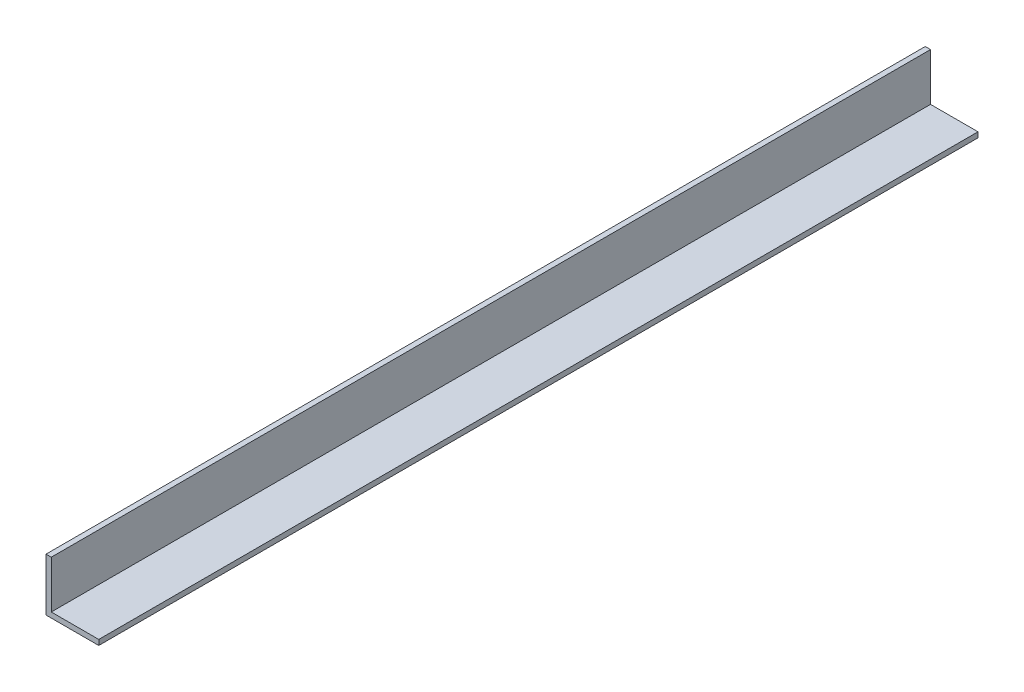
ISO-10303-21;
HEADER;
FILE_DESCRIPTION(('STEP AP214'),'2;1');
FILE_NAME('part.step','',(''),(''),'','','');
FILE_SCHEMA(('AUTOMOTIVE_DESIGN { 1 0 10303 214 1 1 1 1 }'));
ENDSEC;
DATA;
#1=APPLICATION_CONTEXT('core data for automotive mechanical design processes');
#2=APPLICATION_PROTOCOL_DEFINITION('international standard','automotive_design',2000,#1);
#3=PRODUCT_CONTEXT('',#1,'mechanical');
#4=PRODUCT('Part','Part','',(#3));
#5=PRODUCT_RELATED_PRODUCT_CATEGORY('part','',(#4));
#6=PRODUCT_DEFINITION_FORMATION('','',#4);
#7=PRODUCT_DEFINITION_CONTEXT('part definition',#1,'design');
#8=PRODUCT_DEFINITION('design','',#6,#7);
#9=PRODUCT_DEFINITION_SHAPE('','',#8);
#10=(LENGTH_UNIT() NAMED_UNIT(*) SI_UNIT(.MILLI.,.METRE.));
#11=(NAMED_UNIT(*) PLANE_ANGLE_UNIT() SI_UNIT($,.RADIAN.));
#12=(NAMED_UNIT(*) SI_UNIT($,.STERADIAN.) SOLID_ANGLE_UNIT());
#13=UNCERTAINTY_MEASURE_WITH_UNIT(LENGTH_MEASURE(1.E-05),#10,'distance_accuracy_value','');
#14=(GEOMETRIC_REPRESENTATION_CONTEXT(3) GLOBAL_UNCERTAINTY_ASSIGNED_CONTEXT((#13)) GLOBAL_UNIT_ASSIGNED_CONTEXT((#10,
#11,#12)) REPRESENTATION_CONTEXT('',''));
#15=CARTESIAN_POINT('',(0.,0.,0.));
#16=DIRECTION('',(0.,0.,1.));
#17=DIRECTION('',(1.,0.,0.));
#18=AXIS2_PLACEMENT_3D('',#15,#16,#17);
#19=CARTESIAN_POINT('',(30.,0.,500.));
#20=DIRECTION('',(0.,1.,0.));
#21=DIRECTION('',(-1.,0.,0.));
#22=AXIS2_PLACEMENT_3D('',#19,#20,#21);
#23=PLANE('',#22);
#24=DIRECTION('',(1.,0.,0.));
#25=VECTOR('',#24,1.);
#26=CARTESIAN_POINT('',(30.,0.,0.));
#27=LINE('',#26,#25);
#28=CARTESIAN_POINT('',(0.,0.,0.));
#29=VERTEX_POINT('',#28);
#30=CARTESIAN_POINT('',(30.,0.,0.));
#31=VERTEX_POINT('',#30);
#32=EDGE_CURVE('E117',#29,#31,#27,.T.);
#33=ORIENTED_EDGE('',*,*,#32,.T.);
#34=DIRECTION('',(0.,0.,-1.));
#35=VECTOR('',#34,1.);
#36=CARTESIAN_POINT('',(30.,0.,500.));
#37=LINE('',#36,#35);
#38=CARTESIAN_POINT('',(30.,0.,500.));
#39=VERTEX_POINT('',#38);
#40=EDGE_CURVE('E11',#39,#31,#37,.T.);
#41=ORIENTED_EDGE('',*,*,#40,.F.);
#42=DIRECTION('',(1.,0.,0.));
#43=VECTOR('',#42,1.);
#44=CARTESIAN_POINT('',(30.,0.,500.));
#45=LINE('',#44,#43);
#46=CARTESIAN_POINT('',(0.,0.,500.));
#47=VERTEX_POINT('',#46);
#48=EDGE_CURVE('E127',#47,#39,#45,.T.);
#49=ORIENTED_EDGE('',*,*,#48,.F.);
#50=DIRECTION('',(0.,0.,-1.));
#51=VECTOR('',#50,1.);
#52=CARTESIAN_POINT('',(0.,0.,500.));
#53=LINE('',#52,#51);
#54=EDGE_CURVE('E113',#47,#29,#53,.T.);
#55=ORIENTED_EDGE('',*,*,#54,.T.);
#56=EDGE_LOOP('',(#33,#41,#49,#55));
#57=FACE_BOUND('',#56,.T.);
#58=ADVANCED_FACE('F33',(#57),#23,.F.);
#59=CARTESIAN_POINT('',(30.,3.,500.));
#60=DIRECTION('',(-1.,0.,0.));
#61=DIRECTION('',(0.,0.,1.));
#62=AXIS2_PLACEMENT_3D('',#59,#60,#61);
#63=PLANE('',#62);
#64=DIRECTION('',(0.,1.,0.));
#65=VECTOR('',#64,1.);
#66=CARTESIAN_POINT('',(30.,3.,0.));
#67=LINE('',#66,#65);
#68=CARTESIAN_POINT('',(30.,3.,0.));
#69=VERTEX_POINT('',#68);
#70=EDGE_CURVE('E120',#31,#69,#67,.T.);
#71=ORIENTED_EDGE('',*,*,#70,.T.);
#72=DIRECTION('',(0.,0.,-1.));
#73=VECTOR('',#72,1.);
#74=CARTESIAN_POINT('',(30.,3.,500.));
#75=LINE('',#74,#73);
#76=CARTESIAN_POINT('',(30.,3.,500.));
#77=VERTEX_POINT('',#76);
#78=EDGE_CURVE('E41',#77,#69,#75,.T.);
#79=ORIENTED_EDGE('',*,*,#78,.F.);
#80=DIRECTION('',(0.,1.,0.));
#81=VECTOR('',#80,1.);
#82=CARTESIAN_POINT('',(30.,3.,500.));
#83=LINE('',#82,#81);
#84=EDGE_CURVE('E86',#39,#77,#83,.T.);
#85=ORIENTED_EDGE('',*,*,#84,.F.);
#86=ORIENTED_EDGE('',*,*,#40,.T.);
#87=EDGE_LOOP('',(#71,#79,#85,#86));
#88=FACE_BOUND('',#87,.T.);
#89=ADVANCED_FACE('F151',(#88),#63,.F.);
#90=CARTESIAN_POINT('',(3.,3.,500.));
#91=DIRECTION('',(0.,-1.,0.));
#92=DIRECTION('',(0.,0.,-1.));
#93=AXIS2_PLACEMENT_3D('',#90,#91,#92);
#94=PLANE('',#93);
#95=DIRECTION('',(-1.,0.,0.));
#96=VECTOR('',#95,1.);
#97=CARTESIAN_POINT('',(3.,3.,0.));
#98=LINE('',#97,#96);
#99=CARTESIAN_POINT('',(3.,3.,0.));
#100=VERTEX_POINT('',#99);
#101=EDGE_CURVE('E122',#69,#100,#98,.T.);
#102=ORIENTED_EDGE('',*,*,#101,.T.);
#103=DIRECTION('',(0.,0.,-1.));
#104=VECTOR('',#103,1.);
#105=CARTESIAN_POINT('',(3.,3.,500.));
#106=LINE('',#105,#104);
#107=CARTESIAN_POINT('',(3.,3.,500.));
#108=VERTEX_POINT('',#107);
#109=EDGE_CURVE('E108',#108,#100,#106,.T.);
#110=ORIENTED_EDGE('',*,*,#109,.F.);
#111=DIRECTION('',(-1.,0.,0.));
#112=VECTOR('',#111,1.);
#113=CARTESIAN_POINT('',(3.,3.,500.));
#114=LINE('',#113,#112);
#115=EDGE_CURVE('E99',#77,#108,#114,.T.);
#116=ORIENTED_EDGE('',*,*,#115,.F.);
#117=ORIENTED_EDGE('',*,*,#78,.T.);
#118=EDGE_LOOP('',(#102,#110,#116,#117));
#119=FACE_BOUND('',#118,.T.);
#120=ADVANCED_FACE('F133',(#119),#94,.F.);
#121=CARTESIAN_POINT('',(3.,30.,500.));
#122=DIRECTION('',(-1.,0.,0.));
#123=DIRECTION('',(0.,-1.,0.));
#124=AXIS2_PLACEMENT_3D('',#121,#122,#123);
#125=PLANE('',#124);
#126=DIRECTION('',(0.,1.,0.));
#127=VECTOR('',#126,1.);
#128=CARTESIAN_POINT('',(3.,30.,0.));
#129=LINE('',#128,#127);
#130=CARTESIAN_POINT('',(3.,30.,0.));
#131=VERTEX_POINT('',#130);
#132=EDGE_CURVE('E107',#100,#131,#129,.T.);
#133=ORIENTED_EDGE('',*,*,#132,.T.);
#134=DIRECTION('',(0.,0.,-1.));
#135=VECTOR('',#134,1.);
#136=CARTESIAN_POINT('',(3.,30.,500.));
#137=LINE('',#136,#135);
#138=CARTESIAN_POINT('',(3.,30.,500.));
#139=VERTEX_POINT('',#138);
#140=EDGE_CURVE('E104',#139,#131,#137,.T.);
#141=ORIENTED_EDGE('',*,*,#140,.F.);
#142=DIRECTION('',(0.,1.,0.));
#143=VECTOR('',#142,1.);
#144=CARTESIAN_POINT('',(3.,30.,500.));
#145=LINE('',#144,#143);
#146=EDGE_CURVE('E93',#108,#139,#145,.T.);
#147=ORIENTED_EDGE('',*,*,#146,.F.);
#148=ORIENTED_EDGE('',*,*,#109,.T.);
#149=EDGE_LOOP('',(#133,#141,#147,#148));
#150=FACE_BOUND('',#149,.T.);
#151=ADVANCED_FACE('F105',(#150),#125,.F.);
#152=CARTESIAN_POINT('',(0.,30.,500.));
#153=DIRECTION('',(0.,-1.,0.));
#154=DIRECTION('',(0.,0.,-1.));
#155=AXIS2_PLACEMENT_3D('',#152,#153,#154);
#156=PLANE('',#155);
#157=DIRECTION('',(-1.,0.,0.));
#158=VECTOR('',#157,1.);
#159=CARTESIAN_POINT('',(0.,30.,0.));
#160=LINE('',#159,#158);
#161=CARTESIAN_POINT('',(0.,30.,0.));
#162=VERTEX_POINT('',#161);
#163=EDGE_CURVE('E72',#131,#162,#160,.T.);
#164=ORIENTED_EDGE('',*,*,#163,.T.);
#165=DIRECTION('',(0.,0.,-1.));
#166=VECTOR('',#165,1.);
#167=CARTESIAN_POINT('',(0.,30.,500.));
#168=LINE('',#167,#166);
#169=CARTESIAN_POINT('',(0.,30.,500.));
#170=VERTEX_POINT('',#169);
#171=EDGE_CURVE('E109',#170,#162,#168,.T.);
#172=ORIENTED_EDGE('',*,*,#171,.F.);
#173=DIRECTION('',(-1.,0.,0.));
#174=VECTOR('',#173,1.);
#175=CARTESIAN_POINT('',(0.,30.,500.));
#176=LINE('',#175,#174);
#177=EDGE_CURVE('E97',#139,#170,#176,.T.);
#178=ORIENTED_EDGE('',*,*,#177,.F.);
#179=ORIENTED_EDGE('',*,*,#140,.T.);
#180=EDGE_LOOP('',(#164,#172,#178,#179));
#181=FACE_BOUND('',#180,.T.);
#182=ADVANCED_FACE('F111',(#181),#156,.F.);
#183=CARTESIAN_POINT('',(0.,0.,500.));
#184=DIRECTION('',(1.,0.,0.));
#185=DIRECTION('',(0.,0.,-1.));
#186=AXIS2_PLACEMENT_3D('',#183,#184,#185);
#187=PLANE('',#186);
#188=DIRECTION('',(0.,-1.,0.));
#189=VECTOR('',#188,1.);
#190=CARTESIAN_POINT('',(0.,0.,0.));
#191=LINE('',#190,#189);
#192=EDGE_CURVE('E78',#162,#29,#191,.T.);
#193=ORIENTED_EDGE('',*,*,#192,.T.);
#194=ORIENTED_EDGE('',*,*,#54,.F.);
#195=DIRECTION('',(0.,-1.,0.));
#196=VECTOR('',#195,1.);
#197=CARTESIAN_POINT('',(0.,0.,500.));
#198=LINE('',#197,#196);
#199=EDGE_CURVE('E49',#170,#47,#198,.T.);
#200=ORIENTED_EDGE('',*,*,#199,.F.);
#201=ORIENTED_EDGE('',*,*,#171,.T.);
#202=EDGE_LOOP('',(#193,#194,#200,#201));
#203=FACE_BOUND('',#202,.T.);
#204=ADVANCED_FACE('F140',(#203),#187,.F.);
#205=CARTESIAN_POINT('',(0.,0.,500.));
#206=DIRECTION('',(0.,0.,-1.));
#207=DIRECTION('',(-1.,0.,0.));
#208=AXIS2_PLACEMENT_3D('',#205,#206,#207);
#209=PLANE('',#208);
#210=ORIENTED_EDGE('',*,*,#48,.T.);
#211=ORIENTED_EDGE('',*,*,#84,.T.);
#212=ORIENTED_EDGE('',*,*,#115,.T.);
#213=ORIENTED_EDGE('',*,*,#146,.T.);
#214=ORIENTED_EDGE('',*,*,#177,.T.);
#215=ORIENTED_EDGE('',*,*,#199,.T.);
#216=EDGE_LOOP('',(#210,#211,#212,#213,#214,#215));
#217=FACE_BOUND('',#216,.T.);
#218=ADVANCED_FACE('F95',(#217),#209,.F.);
#219=CARTESIAN_POINT('',(0.,0.,0.));
#220=DIRECTION('',(0.,0.,-1.));
#221=DIRECTION('',(-1.,0.,0.));
#222=AXIS2_PLACEMENT_3D('',#219,#220,#221);
#223=PLANE('',#222);
#224=ORIENTED_EDGE('',*,*,#32,.F.);
#225=ORIENTED_EDGE('',*,*,#192,.F.);
#226=ORIENTED_EDGE('',*,*,#163,.F.);
#227=ORIENTED_EDGE('',*,*,#132,.F.);
#228=ORIENTED_EDGE('',*,*,#101,.F.);
#229=ORIENTED_EDGE('',*,*,#70,.F.);
#230=EDGE_LOOP('',(#224,#225,#226,#227,#228,#229));
#231=FACE_BOUND('',#230,.T.);
#232=ADVANCED_FACE('F136',(#231),#223,.T.);
#233=CLOSED_SHELL('',(#58,#89,#120,#151,#182,#204,#218,#232));
#234=MANIFOLD_SOLID_BREP('B2',#233);
#235=ADVANCED_BREP_SHAPE_REPRESENTATION('',(#18,#234),#14);
#236=SHAPE_DEFINITION_REPRESENTATION(#9,#235);
ENDSEC;
END-ISO-10303-21;
